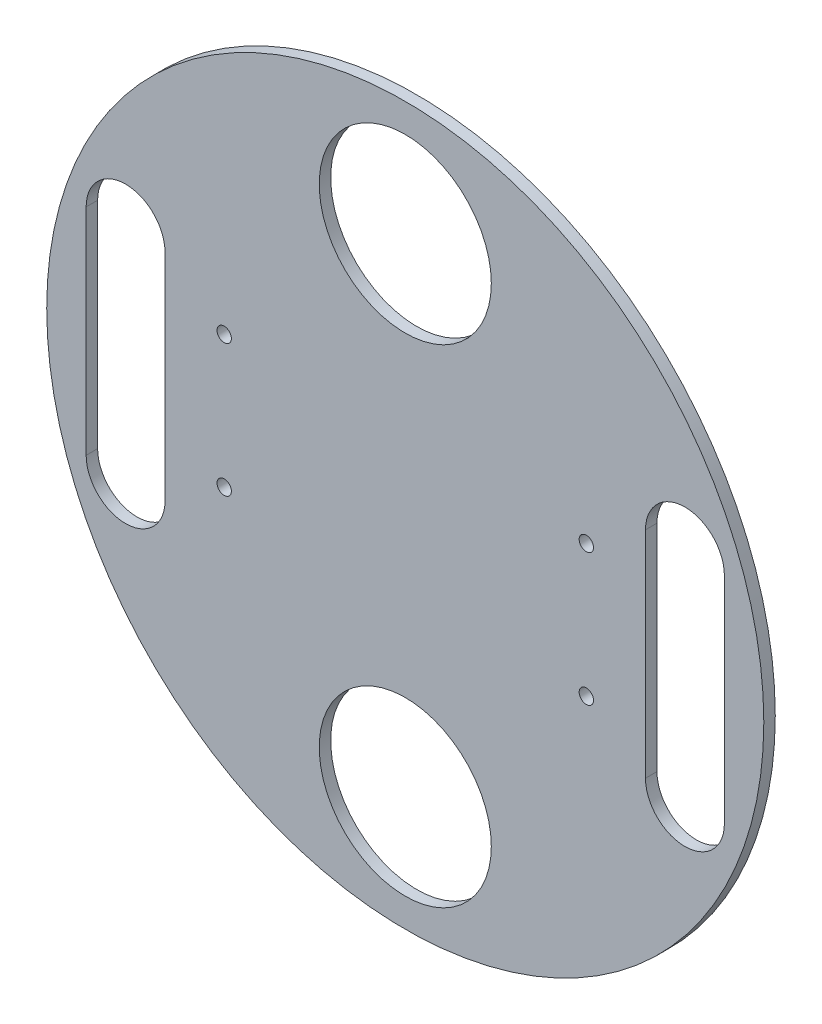
ISO-10303-21;
HEADER;
FILE_DESCRIPTION(('STEP AP214'),'2;1');
FILE_NAME('part.step','',(''),(''),'','','');
FILE_SCHEMA(('AUTOMOTIVE_DESIGN { 1 0 10303 214 1 1 1 1 }'));
ENDSEC;
DATA;
#1=APPLICATION_CONTEXT('core data for automotive mechanical design processes');
#2=APPLICATION_PROTOCOL_DEFINITION('international standard','automotive_design',2000,#1);
#3=PRODUCT_CONTEXT('',#1,'mechanical');
#4=PRODUCT('Part','Part','',(#3));
#5=PRODUCT_RELATED_PRODUCT_CATEGORY('part','',(#4));
#6=PRODUCT_DEFINITION_FORMATION('','',#4);
#7=PRODUCT_DEFINITION_CONTEXT('part definition',#1,'design');
#8=PRODUCT_DEFINITION('design','',#6,#7);
#9=PRODUCT_DEFINITION_SHAPE('','',#8);
#10=(LENGTH_UNIT() NAMED_UNIT(*) SI_UNIT(.MILLI.,.METRE.));
#11=(NAMED_UNIT(*) PLANE_ANGLE_UNIT() SI_UNIT($,.RADIAN.));
#12=(NAMED_UNIT(*) SI_UNIT($,.STERADIAN.) SOLID_ANGLE_UNIT());
#13=UNCERTAINTY_MEASURE_WITH_UNIT(LENGTH_MEASURE(1.E-05),#10,'distance_accuracy_value','');
#14=(GEOMETRIC_REPRESENTATION_CONTEXT(3) GLOBAL_UNCERTAINTY_ASSIGNED_CONTEXT((#13)) GLOBAL_UNIT_ASSIGNED_CONTEXT((#10,
#11,#12)) REPRESENTATION_CONTEXT('',''));
#15=CARTESIAN_POINT('',(0.,0.,0.));
#16=DIRECTION('',(0.,0.,1.));
#17=DIRECTION('',(1.,0.,0.));
#18=AXIS2_PLACEMENT_3D('',#15,#16,#17);
#19=CARTESIAN_POINT('',(0.,0.,1.6));
#20=DIRECTION('',(0.,0.,1.));
#21=DIRECTION('',(1.,0.,0.));
#22=AXIS2_PLACEMENT_3D('',#19,#20,#21);
#23=PLANE('',#22);
#24=CARTESIAN_POINT('',(25.25,9.2210945737442,1.6));
#25=DIRECTION('',(0.,0.,-1.));
#26=DIRECTION('',(1.,0.,0.));
#27=AXIS2_PLACEMENT_3D('',#24,#25,#26);
#28=CIRCLE('',#27,1.);
#29=CARTESIAN_POINT('',(26.25,9.2210945737442,1.6));
#30=VERTEX_POINT('',#29);
#31=EDGE_CURVE('E263',#30,#30,#28,.T.);
#32=ORIENTED_EDGE('',*,*,#31,.T.);
#33=EDGE_LOOP('',(#32));
#34=FACE_BOUND('',#33,.T.);
#35=CARTESIAN_POINT('',(25.25,-9.2210945737442,1.6));
#36=DIRECTION('',(0.,0.,1.));
#37=DIRECTION('',(1.,0.,0.));
#38=AXIS2_PLACEMENT_3D('',#35,#36,#37);
#39=CIRCLE('',#38,1.);
#40=CARTESIAN_POINT('',(26.25,-9.2210945737442,1.6));
#41=VERTEX_POINT('',#40);
#42=EDGE_CURVE('E269',#41,#41,#39,.T.);
#43=ORIENTED_EDGE('',*,*,#42,.F.);
#44=EDGE_LOOP('',(#43));
#45=FACE_BOUND('',#44,.T.);
#46=DIRECTION('',(0.,1.,0.));
#47=VECTOR('',#46,1.);
#48=CARTESIAN_POINT('',(33.5,15.,1.6));
#49=LINE('',#48,#47);
#50=CARTESIAN_POINT('',(33.5,-15.,1.6));
#51=VERTEX_POINT('',#50);
#52=CARTESIAN_POINT('',(33.5,15.,1.6));
#53=VERTEX_POINT('',#52);
#54=EDGE_CURVE('E127',#51,#53,#49,.T.);
#55=ORIENTED_EDGE('',*,*,#54,.T.);
#56=CARTESIAN_POINT('',(39.,15.,1.6));
#57=DIRECTION('',(0.,0.,-1.));
#58=DIRECTION('',(1.,0.,0.));
#59=AXIS2_PLACEMENT_3D('',#56,#57,#58);
#60=CIRCLE('',#59,5.5);
#61=CARTESIAN_POINT('',(44.5,15.,1.6));
#62=VERTEX_POINT('',#61);
#63=EDGE_CURVE('E48',#53,#62,#60,.T.);
#64=ORIENTED_EDGE('',*,*,#63,.T.);
#65=DIRECTION('',(0.,-1.,0.));
#66=VECTOR('',#65,1.);
#67=CARTESIAN_POINT('',(44.5,15.,1.6));
#68=LINE('',#67,#66);
#69=CARTESIAN_POINT('',(44.5,-15.,1.6));
#70=VERTEX_POINT('',#69);
#71=EDGE_CURVE('E115',#62,#70,#68,.T.);
#72=ORIENTED_EDGE('',*,*,#71,.T.);
#73=CARTESIAN_POINT('',(39.,-15.,1.6));
#74=DIRECTION('',(0.,0.,-1.));
#75=DIRECTION('',(-1.,0.,0.));
#76=AXIS2_PLACEMENT_3D('',#73,#74,#75);
#77=CIRCLE('',#76,5.5);
#78=EDGE_CURVE('E118',#70,#51,#77,.T.);
#79=ORIENTED_EDGE('',*,*,#78,.T.);
#80=EDGE_LOOP('',(#55,#64,#72,#79));
#81=FACE_BOUND('',#80,.T.);
#82=CARTESIAN_POINT('',(-39.,15.,1.6));
#83=DIRECTION('',(0.,0.,1.));
#84=DIRECTION('',(-1.,0.,0.));
#85=AXIS2_PLACEMENT_3D('',#82,#83,#84);
#86=CIRCLE('',#85,5.5);
#87=CARTESIAN_POINT('',(-33.5,15.,1.6));
#88=VERTEX_POINT('',#87);
#89=CARTESIAN_POINT('',(-44.5,15.,1.6));
#90=VERTEX_POINT('',#89);
#91=EDGE_CURVE('E134',#88,#90,#86,.T.);
#92=ORIENTED_EDGE('',*,*,#91,.F.);
#93=DIRECTION('',(0.,1.,0.));
#94=VECTOR('',#93,1.);
#95=CARTESIAN_POINT('',(-33.5,15.,1.6));
#96=LINE('',#95,#94);
#97=CARTESIAN_POINT('',(-33.5,-15.,1.6));
#98=VERTEX_POINT('',#97);
#99=EDGE_CURVE('E142',#98,#88,#96,.T.);
#100=ORIENTED_EDGE('',*,*,#99,.F.);
#101=CARTESIAN_POINT('',(-39.,-15.,1.6));
#102=DIRECTION('',(0.,0.,1.));
#103=DIRECTION('',(1.,0.,0.));
#104=AXIS2_PLACEMENT_3D('',#101,#102,#103);
#105=CIRCLE('',#104,5.5);
#106=CARTESIAN_POINT('',(-44.5,-15.,1.6));
#107=VERTEX_POINT('',#106);
#108=EDGE_CURVE('E156',#107,#98,#105,.T.);
#109=ORIENTED_EDGE('',*,*,#108,.F.);
#110=DIRECTION('',(0.,-1.,0.));
#111=VECTOR('',#110,1.);
#112=CARTESIAN_POINT('',(-44.5,15.,1.6));
#113=LINE('',#112,#111);
#114=EDGE_CURVE('E153',#90,#107,#113,.T.);
#115=ORIENTED_EDGE('',*,*,#114,.F.);
#116=EDGE_LOOP('',(#92,#100,#109,#115));
#117=FACE_BOUND('',#116,.T.);
#118=CARTESIAN_POINT('',(0.,0.,1.6));
#119=DIRECTION('',(0.,0.,1.));
#120=DIRECTION('',(1.,0.,0.));
#121=AXIS2_PLACEMENT_3D('',#118,#119,#120);
#122=CIRCLE('',#121,50.);
#123=CARTESIAN_POINT('',(50.,0.,1.6));
#124=VERTEX_POINT('',#123);
#125=EDGE_CURVE('E11',#124,#124,#122,.T.);
#126=ORIENTED_EDGE('',*,*,#125,.T.);
#127=EDGE_LOOP('',(#126));
#128=FACE_BOUND('',#127,.T.);
#129=CARTESIAN_POINT('',(0.,34.,1.6));
#130=DIRECTION('',(0.,0.,1.));
#131=DIRECTION('',(1.,0.,0.));
#132=AXIS2_PLACEMENT_3D('',#129,#130,#131);
#133=CIRCLE('',#132,12.);
#134=CARTESIAN_POINT('',(12.,34.,1.6));
#135=VERTEX_POINT('',#134);
#136=EDGE_CURVE('E121',#135,#135,#133,.T.);
#137=ORIENTED_EDGE('',*,*,#136,.F.);
#138=EDGE_LOOP('',(#137));
#139=FACE_BOUND('',#138,.T.);
#140=CARTESIAN_POINT('',(0.,-34.,1.6));
#141=DIRECTION('',(0.,0.,-1.));
#142=DIRECTION('',(1.,0.,0.));
#143=AXIS2_PLACEMENT_3D('',#140,#141,#142);
#144=CIRCLE('',#143,12.);
#145=CARTESIAN_POINT('',(12.,-34.,1.6));
#146=VERTEX_POINT('',#145);
#147=EDGE_CURVE('E274',#146,#146,#144,.T.);
#148=ORIENTED_EDGE('',*,*,#147,.T.);
#149=EDGE_LOOP('',(#148));
#150=FACE_BOUND('',#149,.T.);
#151=CARTESIAN_POINT('',(-25.25,9.2210945737442,1.6));
#152=DIRECTION('',(0.,0.,1.));
#153=DIRECTION('',(-1.,0.,0.));
#154=AXIS2_PLACEMENT_3D('',#151,#152,#153);
#155=CIRCLE('',#154,1.);
#156=CARTESIAN_POINT('',(-26.25,9.2210945737442,1.6));
#157=VERTEX_POINT('',#156);
#158=EDGE_CURVE('E257',#157,#157,#155,.T.);
#159=ORIENTED_EDGE('',*,*,#158,.F.);
#160=EDGE_LOOP('',(#159));
#161=FACE_BOUND('',#160,.T.);
#162=CARTESIAN_POINT('',(-25.25,-9.2210945737442,1.6));
#163=DIRECTION('',(0.,0.,-1.));
#164=DIRECTION('',(-1.,0.,0.));
#165=AXIS2_PLACEMENT_3D('',#162,#163,#164);
#166=CIRCLE('',#165,1.);
#167=CARTESIAN_POINT('',(-26.25,-9.2210945737442,1.6));
#168=VERTEX_POINT('',#167);
#169=EDGE_CURVE('E254',#168,#168,#166,.T.);
#170=ORIENTED_EDGE('',*,*,#169,.T.);
#171=EDGE_LOOP('',(#170));
#172=FACE_BOUND('',#171,.T.);
#173=ADVANCED_FACE('F33',(#34,#45,#81,#117,#128,#139,#150,#161,#172),#23,.T.);
#174=CARTESIAN_POINT('',(0.,0.,0.));
#175=DIRECTION('',(0.,0.,1.));
#176=DIRECTION('',(1.,0.,0.));
#177=AXIS2_PLACEMENT_3D('',#174,#175,#176);
#178=PLANE('',#177);
#179=CARTESIAN_POINT('',(25.25,9.2210945737442,0.));
#180=DIRECTION('',(0.,0.,-1.));
#181=DIRECTION('',(1.,0.,0.));
#182=AXIS2_PLACEMENT_3D('',#179,#180,#181);
#183=CIRCLE('',#182,1.);
#184=CARTESIAN_POINT('',(26.25,9.2210945737442,0.));
#185=VERTEX_POINT('',#184);
#186=EDGE_CURVE('E266',#185,#185,#183,.T.);
#187=ORIENTED_EDGE('',*,*,#186,.F.);
#188=EDGE_LOOP('',(#187));
#189=FACE_BOUND('',#188,.T.);
#190=CARTESIAN_POINT('',(25.25,-9.2210945737442,0.));
#191=DIRECTION('',(0.,0.,1.));
#192=DIRECTION('',(1.,0.,0.));
#193=AXIS2_PLACEMENT_3D('',#190,#191,#192);
#194=CIRCLE('',#193,1.);
#195=CARTESIAN_POINT('',(26.25,-9.2210945737442,0.));
#196=VERTEX_POINT('',#195);
#197=EDGE_CURVE('E271',#196,#196,#194,.T.);
#198=ORIENTED_EDGE('',*,*,#197,.T.);
#199=EDGE_LOOP('',(#198));
#200=FACE_BOUND('',#199,.T.);
#201=CARTESIAN_POINT('',(39.,15.,0.));
#202=DIRECTION('',(0.,0.,-1.));
#203=DIRECTION('',(1.,0.,0.));
#204=AXIS2_PLACEMENT_3D('',#201,#202,#203);
#205=CIRCLE('',#204,5.5);
#206=CARTESIAN_POINT('',(33.5,15.,0.));
#207=VERTEX_POINT('',#206);
#208=CARTESIAN_POINT('',(44.5,15.,0.));
#209=VERTEX_POINT('',#208);
#210=EDGE_CURVE('E106',#207,#209,#205,.T.);
#211=ORIENTED_EDGE('',*,*,#210,.F.);
#212=DIRECTION('',(0.,1.,0.));
#213=VECTOR('',#212,1.);
#214=CARTESIAN_POINT('',(33.5,15.,0.));
#215=LINE('',#214,#213);
#216=CARTESIAN_POINT('',(33.5,-15.,0.));
#217=VERTEX_POINT('',#216);
#218=EDGE_CURVE('E98',#217,#207,#215,.T.);
#219=ORIENTED_EDGE('',*,*,#218,.F.);
#220=CARTESIAN_POINT('',(39.,-15.,0.));
#221=DIRECTION('',(0.,0.,-1.));
#222=DIRECTION('',(-1.,0.,0.));
#223=AXIS2_PLACEMENT_3D('',#220,#221,#222);
#224=CIRCLE('',#223,5.5);
#225=CARTESIAN_POINT('',(44.5,-15.,0.));
#226=VERTEX_POINT('',#225);
#227=EDGE_CURVE('E105',#226,#217,#224,.T.);
#228=ORIENTED_EDGE('',*,*,#227,.F.);
#229=DIRECTION('',(0.,-1.,0.));
#230=VECTOR('',#229,1.);
#231=CARTESIAN_POINT('',(44.5,15.,0.));
#232=LINE('',#231,#230);
#233=EDGE_CURVE('E110',#209,#226,#232,.T.);
#234=ORIENTED_EDGE('',*,*,#233,.F.);
#235=EDGE_LOOP('',(#211,#219,#228,#234));
#236=FACE_BOUND('',#235,.T.);
#237=DIRECTION('',(0.,1.,0.));
#238=VECTOR('',#237,1.);
#239=CARTESIAN_POINT('',(-33.5,15.,0.));
#240=LINE('',#239,#238);
#241=CARTESIAN_POINT('',(-33.5,-15.,0.));
#242=VERTEX_POINT('',#241);
#243=CARTESIAN_POINT('',(-33.5,15.,0.));
#244=VERTEX_POINT('',#243);
#245=EDGE_CURVE('E148',#242,#244,#240,.T.);
#246=ORIENTED_EDGE('',*,*,#245,.T.);
#247=CARTESIAN_POINT('',(-39.,15.,0.));
#248=DIRECTION('',(0.,0.,1.));
#249=DIRECTION('',(-1.,0.,0.));
#250=AXIS2_PLACEMENT_3D('',#247,#248,#249);
#251=CIRCLE('',#250,5.5);
#252=CARTESIAN_POINT('',(-44.5,15.,0.));
#253=VERTEX_POINT('',#252);
#254=EDGE_CURVE('E138',#244,#253,#251,.T.);
#255=ORIENTED_EDGE('',*,*,#254,.T.);
#256=DIRECTION('',(0.,-1.,0.));
#257=VECTOR('',#256,1.);
#258=CARTESIAN_POINT('',(-44.5,15.,0.));
#259=LINE('',#258,#257);
#260=CARTESIAN_POINT('',(-44.5,-15.,0.));
#261=VERTEX_POINT('',#260);
#262=EDGE_CURVE('E141',#253,#261,#259,.T.);
#263=ORIENTED_EDGE('',*,*,#262,.T.);
#264=CARTESIAN_POINT('',(-39.,-15.,0.));
#265=DIRECTION('',(0.,0.,1.));
#266=DIRECTION('',(1.,0.,0.));
#267=AXIS2_PLACEMENT_3D('',#264,#265,#266);
#268=CIRCLE('',#267,5.5);
#269=EDGE_CURVE('E145',#261,#242,#268,.T.);
#270=ORIENTED_EDGE('',*,*,#269,.T.);
#271=EDGE_LOOP('',(#246,#255,#263,#270));
#272=FACE_BOUND('',#271,.T.);
#273=CARTESIAN_POINT('',(0.,0.,0.));
#274=DIRECTION('',(0.,0.,1.));
#275=DIRECTION('',(1.,0.,0.));
#276=AXIS2_PLACEMENT_3D('',#273,#274,#275);
#277=CIRCLE('',#276,50.);
#278=CARTESIAN_POINT('',(50.,0.,0.));
#279=VERTEX_POINT('',#278);
#280=EDGE_CURVE('E37',#279,#279,#277,.T.);
#281=ORIENTED_EDGE('',*,*,#280,.F.);
#282=EDGE_LOOP('',(#281));
#283=FACE_BOUND('',#282,.T.);
#284=CARTESIAN_POINT('',(0.,34.,0.));
#285=DIRECTION('',(0.,0.,1.));
#286=DIRECTION('',(1.,0.,0.));
#287=AXIS2_PLACEMENT_3D('',#284,#285,#286);
#288=CIRCLE('',#287,12.);
#289=CARTESIAN_POINT('',(12.,34.,0.));
#290=VERTEX_POINT('',#289);
#291=EDGE_CURVE('E128',#290,#290,#288,.T.);
#292=ORIENTED_EDGE('',*,*,#291,.T.);
#293=EDGE_LOOP('',(#292));
#294=FACE_BOUND('',#293,.T.);
#295=CARTESIAN_POINT('',(0.,-34.,0.));
#296=DIRECTION('',(0.,0.,-1.));
#297=DIRECTION('',(1.,0.,0.));
#298=AXIS2_PLACEMENT_3D('',#295,#296,#297);
#299=CIRCLE('',#298,12.);
#300=CARTESIAN_POINT('',(12.,-34.,0.));
#301=VERTEX_POINT('',#300);
#302=EDGE_CURVE('E277',#301,#301,#299,.T.);
#303=ORIENTED_EDGE('',*,*,#302,.F.);
#304=EDGE_LOOP('',(#303));
#305=FACE_BOUND('',#304,.T.);
#306=CARTESIAN_POINT('',(-25.25,9.2210945737442,0.));
#307=DIRECTION('',(0.,0.,1.));
#308=DIRECTION('',(-1.,0.,0.));
#309=AXIS2_PLACEMENT_3D('',#306,#307,#308);
#310=CIRCLE('',#309,1.);
#311=CARTESIAN_POINT('',(-26.25,9.2210945737442,0.));
#312=VERTEX_POINT('',#311);
#313=EDGE_CURVE('E260',#312,#312,#310,.T.);
#314=ORIENTED_EDGE('',*,*,#313,.T.);
#315=EDGE_LOOP('',(#314));
#316=FACE_BOUND('',#315,.T.);
#317=CARTESIAN_POINT('',(-25.25,-9.2210945737442,0.));
#318=DIRECTION('',(0.,0.,-1.));
#319=DIRECTION('',(-1.,0.,0.));
#320=AXIS2_PLACEMENT_3D('',#317,#318,#319);
#321=CIRCLE('',#320,1.);
#322=CARTESIAN_POINT('',(-26.25,-9.2210945737442,0.));
#323=VERTEX_POINT('',#322);
#324=EDGE_CURVE('E251',#323,#323,#321,.T.);
#325=ORIENTED_EDGE('',*,*,#324,.F.);
#326=EDGE_LOOP('',(#325));
#327=FACE_BOUND('',#326,.T.);
#328=ADVANCED_FACE('F113',(#189,#200,#236,#272,#283,#294,#305,#316,#327),#178,.F.);
#329=CARTESIAN_POINT('',(0.,0.,1.6));
#330=DIRECTION('',(0.,0.,-1.));
#331=DIRECTION('',(-1.,0.,0.));
#332=AXIS2_PLACEMENT_3D('',#329,#330,#331);
#333=CYLINDRICAL_SURFACE('',#332,50.);
#334=ORIENTED_EDGE('',*,*,#125,.F.);
#335=EDGE_LOOP('',(#334));
#336=FACE_BOUND('',#335,.T.);
#337=ORIENTED_EDGE('',*,*,#280,.T.);
#338=EDGE_LOOP('',(#337));
#339=FACE_BOUND('',#338,.T.);
#340=ADVANCED_FACE('F35',(#336,#339),#333,.T.);
#341=CARTESIAN_POINT('',(-39.,15.,0.));
#342=DIRECTION('',(0.,0.,1.));
#343=DIRECTION('',(1.,0.,0.));
#344=AXIS2_PLACEMENT_3D('',#341,#342,#343);
#345=CYLINDRICAL_SURFACE('',#344,5.5);
#346=ORIENTED_EDGE('',*,*,#91,.T.);
#347=DIRECTION('',(0.,0.,1.));
#348=VECTOR('',#347,1.);
#349=CARTESIAN_POINT('',(-44.5,15.,0.));
#350=LINE('',#349,#348);
#351=EDGE_CURVE('E151',#253,#90,#350,.T.);
#352=ORIENTED_EDGE('',*,*,#351,.F.);
#353=ORIENTED_EDGE('',*,*,#254,.F.);
#354=DIRECTION('',(0.,0.,1.));
#355=VECTOR('',#354,1.);
#356=CARTESIAN_POINT('',(-33.5,15.,0.));
#357=LINE('',#356,#355);
#358=EDGE_CURVE('E161',#244,#88,#357,.T.);
#359=ORIENTED_EDGE('',*,*,#358,.T.);
#360=EDGE_LOOP('',(#346,#352,#353,#359));
#361=FACE_BOUND('',#360,.T.);
#362=ADVANCED_FACE('F184',(#361),#345,.F.);
#363=CARTESIAN_POINT('',(-33.5,15.,0.));
#364=DIRECTION('',(1.,0.,0.));
#365=DIRECTION('',(0.,1.,0.));
#366=AXIS2_PLACEMENT_3D('',#363,#364,#365);
#367=PLANE('',#366);
#368=ORIENTED_EDGE('',*,*,#99,.T.);
#369=ORIENTED_EDGE('',*,*,#358,.F.);
#370=ORIENTED_EDGE('',*,*,#245,.F.);
#371=DIRECTION('',(0.,0.,1.));
#372=VECTOR('',#371,1.);
#373=CARTESIAN_POINT('',(-33.5,-15.,0.));
#374=LINE('',#373,#372);
#375=EDGE_CURVE('E163',#242,#98,#374,.T.);
#376=ORIENTED_EDGE('',*,*,#375,.T.);
#377=EDGE_LOOP('',(#368,#369,#370,#376));
#378=FACE_BOUND('',#377,.T.);
#379=ADVANCED_FACE('F186',(#378),#367,.F.);
#380=CARTESIAN_POINT('',(-39.,-15.,0.));
#381=DIRECTION('',(0.,0.,1.));
#382=DIRECTION('',(1.,0.,0.));
#383=AXIS2_PLACEMENT_3D('',#380,#381,#382);
#384=CYLINDRICAL_SURFACE('',#383,5.5);
#385=ORIENTED_EDGE('',*,*,#108,.T.);
#386=ORIENTED_EDGE('',*,*,#375,.F.);
#387=ORIENTED_EDGE('',*,*,#269,.F.);
#388=DIRECTION('',(0.,0.,1.));
#389=VECTOR('',#388,1.);
#390=CARTESIAN_POINT('',(-44.5,-15.,0.));
#391=LINE('',#390,#389);
#392=EDGE_CURVE('E165',#261,#107,#391,.T.);
#393=ORIENTED_EDGE('',*,*,#392,.T.);
#394=EDGE_LOOP('',(#385,#386,#387,#393));
#395=FACE_BOUND('',#394,.T.);
#396=ADVANCED_FACE('F181',(#395),#384,.F.);
#397=CARTESIAN_POINT('',(-44.5,15.,0.));
#398=DIRECTION('',(-1.,0.,0.));
#399=DIRECTION('',(0.,-1.,0.));
#400=AXIS2_PLACEMENT_3D('',#397,#398,#399);
#401=PLANE('',#400);
#402=ORIENTED_EDGE('',*,*,#114,.T.);
#403=ORIENTED_EDGE('',*,*,#392,.F.);
#404=ORIENTED_EDGE('',*,*,#262,.F.);
#405=ORIENTED_EDGE('',*,*,#351,.T.);
#406=EDGE_LOOP('',(#402,#403,#404,#405));
#407=FACE_BOUND('',#406,.T.);
#408=ADVANCED_FACE('F171',(#407),#401,.F.);
#409=CARTESIAN_POINT('',(39.,15.,0.));
#410=DIRECTION('',(0.,0.,1.));
#411=DIRECTION('',(1.,0.,0.));
#412=AXIS2_PLACEMENT_3D('',#409,#410,#411);
#413=CYLINDRICAL_SURFACE('',#412,5.5);
#414=ORIENTED_EDGE('',*,*,#63,.F.);
#415=DIRECTION('',(0.,0.,1.));
#416=VECTOR('',#415,1.);
#417=CARTESIAN_POINT('',(33.5,15.,0.));
#418=LINE('',#417,#416);
#419=EDGE_CURVE('E100',#207,#53,#418,.T.);
#420=ORIENTED_EDGE('',*,*,#419,.F.);
#421=ORIENTED_EDGE('',*,*,#210,.T.);
#422=DIRECTION('',(0.,0.,1.));
#423=VECTOR('',#422,1.);
#424=CARTESIAN_POINT('',(44.5,15.,0.));
#425=LINE('',#424,#423);
#426=EDGE_CURVE('E132',#209,#62,#425,.T.);
#427=ORIENTED_EDGE('',*,*,#426,.T.);
#428=EDGE_LOOP('',(#414,#420,#421,#427));
#429=FACE_BOUND('',#428,.T.);
#430=ADVANCED_FACE('F108',(#429),#413,.F.);
#431=CARTESIAN_POINT('',(44.5,15.,0.));
#432=DIRECTION('',(-1.,0.,0.));
#433=DIRECTION('',(0.,-1.,0.));
#434=AXIS2_PLACEMENT_3D('',#431,#432,#433);
#435=PLANE('',#434);
#436=ORIENTED_EDGE('',*,*,#71,.F.);
#437=ORIENTED_EDGE('',*,*,#426,.F.);
#438=ORIENTED_EDGE('',*,*,#233,.T.);
#439=DIRECTION('',(0.,0.,1.));
#440=VECTOR('',#439,1.);
#441=CARTESIAN_POINT('',(44.5,-15.,0.));
#442=LINE('',#441,#440);
#443=EDGE_CURVE('E135',#226,#70,#442,.T.);
#444=ORIENTED_EDGE('',*,*,#443,.T.);
#445=EDGE_LOOP('',(#436,#437,#438,#444));
#446=FACE_BOUND('',#445,.T.);
#447=ADVANCED_FACE('F210',(#446),#435,.T.);
#448=CARTESIAN_POINT('',(39.,-15.,0.));
#449=DIRECTION('',(0.,0.,1.));
#450=DIRECTION('',(1.,0.,0.));
#451=AXIS2_PLACEMENT_3D('',#448,#449,#450);
#452=CYLINDRICAL_SURFACE('',#451,5.5);
#453=ORIENTED_EDGE('',*,*,#78,.F.);
#454=ORIENTED_EDGE('',*,*,#443,.F.);
#455=ORIENTED_EDGE('',*,*,#227,.T.);
#456=DIRECTION('',(0.,0.,1.));
#457=VECTOR('',#456,1.);
#458=CARTESIAN_POINT('',(33.5,-15.,0.));
#459=LINE('',#458,#457);
#460=EDGE_CURVE('E56',#217,#51,#459,.T.);
#461=ORIENTED_EDGE('',*,*,#460,.T.);
#462=EDGE_LOOP('',(#453,#454,#455,#461));
#463=FACE_BOUND('',#462,.T.);
#464=ADVANCED_FACE('F214',(#463),#452,.F.);
#465=CARTESIAN_POINT('',(33.5,15.,0.));
#466=DIRECTION('',(1.,0.,0.));
#467=DIRECTION('',(0.,1.,0.));
#468=AXIS2_PLACEMENT_3D('',#465,#466,#467);
#469=PLANE('',#468);
#470=ORIENTED_EDGE('',*,*,#54,.F.);
#471=ORIENTED_EDGE('',*,*,#460,.F.);
#472=ORIENTED_EDGE('',*,*,#218,.T.);
#473=ORIENTED_EDGE('',*,*,#419,.T.);
#474=EDGE_LOOP('',(#470,#471,#472,#473));
#475=FACE_BOUND('',#474,.T.);
#476=ADVANCED_FACE('F99',(#475),#469,.T.);
#477=CARTESIAN_POINT('',(0.,34.,0.));
#478=DIRECTION('',(0.,0.,1.));
#479=DIRECTION('',(1.,0.,0.));
#480=AXIS2_PLACEMENT_3D('',#477,#478,#479);
#481=CYLINDRICAL_SURFACE('',#480,12.);
#482=ORIENTED_EDGE('',*,*,#291,.F.);
#483=EDGE_LOOP('',(#482));
#484=FACE_BOUND('',#483,.T.);
#485=ORIENTED_EDGE('',*,*,#136,.T.);
#486=EDGE_LOOP('',(#485));
#487=FACE_BOUND('',#486,.T.);
#488=ADVANCED_FACE('F220',(#484,#487),#481,.F.);
#489=CARTESIAN_POINT('',(0.,-34.,0.));
#490=DIRECTION('',(0.,0.,1.));
#491=DIRECTION('',(1.,0.,0.));
#492=AXIS2_PLACEMENT_3D('',#489,#490,#491);
#493=CYLINDRICAL_SURFACE('',#492,12.);
#494=ORIENTED_EDGE('',*,*,#302,.T.);
#495=EDGE_LOOP('',(#494));
#496=FACE_BOUND('',#495,.T.);
#497=ORIENTED_EDGE('',*,*,#147,.F.);
#498=EDGE_LOOP('',(#497));
#499=FACE_BOUND('',#498,.T.);
#500=ADVANCED_FACE('F226',(#496,#499),#493,.F.);
#501=CARTESIAN_POINT('',(25.25,-9.2210945737442,0.));
#502=DIRECTION('',(0.,0.,1.));
#503=DIRECTION('',(1.,0.,0.));
#504=AXIS2_PLACEMENT_3D('',#501,#502,#503);
#505=CYLINDRICAL_SURFACE('',#504,1.);
#506=ORIENTED_EDGE('',*,*,#197,.F.);
#507=EDGE_LOOP('',(#506));
#508=FACE_BOUND('',#507,.T.);
#509=ORIENTED_EDGE('',*,*,#42,.T.);
#510=EDGE_LOOP('',(#509));
#511=FACE_BOUND('',#510,.T.);
#512=ADVANCED_FACE('F230',(#508,#511),#505,.F.);
#513=CARTESIAN_POINT('',(25.25,9.2210945737442,0.));
#514=DIRECTION('',(0.,0.,1.));
#515=DIRECTION('',(1.,0.,0.));
#516=AXIS2_PLACEMENT_3D('',#513,#514,#515);
#517=CYLINDRICAL_SURFACE('',#516,1.);
#518=ORIENTED_EDGE('',*,*,#186,.T.);
#519=EDGE_LOOP('',(#518));
#520=FACE_BOUND('',#519,.T.);
#521=ORIENTED_EDGE('',*,*,#31,.F.);
#522=EDGE_LOOP('',(#521));
#523=FACE_BOUND('',#522,.T.);
#524=ADVANCED_FACE('F234',(#520,#523),#517,.F.);
#525=CARTESIAN_POINT('',(-25.25,9.2210945737442,0.));
#526=DIRECTION('',(0.,0.,1.));
#527=DIRECTION('',(1.,0.,0.));
#528=AXIS2_PLACEMENT_3D('',#525,#526,#527);
#529=CYLINDRICAL_SURFACE('',#528,1.);
#530=ORIENTED_EDGE('',*,*,#313,.F.);
#531=EDGE_LOOP('',(#530));
#532=FACE_BOUND('',#531,.T.);
#533=ORIENTED_EDGE('',*,*,#158,.T.);
#534=EDGE_LOOP('',(#533));
#535=FACE_BOUND('',#534,.T.);
#536=ADVANCED_FACE('F238',(#532,#535),#529,.F.);
#537=CARTESIAN_POINT('',(-25.25,-9.2210945737442,0.));
#538=DIRECTION('',(0.,0.,1.));
#539=DIRECTION('',(1.,0.,0.));
#540=AXIS2_PLACEMENT_3D('',#537,#538,#539);
#541=CYLINDRICAL_SURFACE('',#540,1.);
#542=ORIENTED_EDGE('',*,*,#324,.T.);
#543=EDGE_LOOP('',(#542));
#544=FACE_BOUND('',#543,.T.);
#545=ORIENTED_EDGE('',*,*,#169,.F.);
#546=EDGE_LOOP('',(#545));
#547=FACE_BOUND('',#546,.T.);
#548=ADVANCED_FACE('F242',(#544,#547),#541,.F.);
#549=CLOSED_SHELL('',(#173,#328,#340,#362,#379,#396,#408,#430,#447,#464,#476,#488,#500,#512,
#524,#536,#548));
#550=MANIFOLD_SOLID_BREP('B2',#549);
#551=ADVANCED_BREP_SHAPE_REPRESENTATION('',(#18,#550),#14);
#552=SHAPE_DEFINITION_REPRESENTATION(#9,#551);
ENDSEC;
END-ISO-10303-21;
